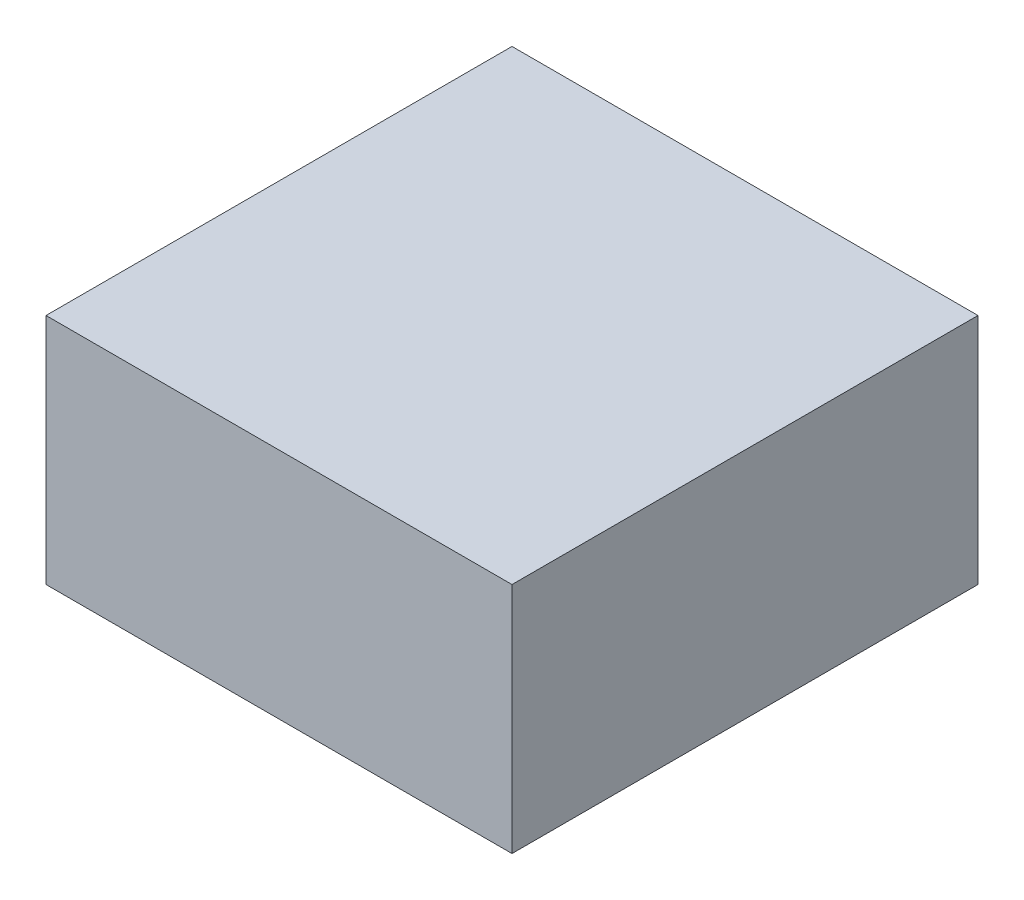
ISO-10303-21;
HEADER;
FILE_DESCRIPTION(('STEP AP214'),'2;1');
FILE_NAME('part.step','',(''),(''),'','','');
FILE_SCHEMA(('AUTOMOTIVE_DESIGN { 1 0 10303 214 1 1 1 1 }'));
ENDSEC;
DATA;
#1=APPLICATION_CONTEXT('core data for automotive mechanical design processes');
#2=APPLICATION_PROTOCOL_DEFINITION('international standard','automotive_design',2000,#1);
#3=PRODUCT_CONTEXT('',#1,'mechanical');
#4=PRODUCT('Part','Part','',(#3));
#5=PRODUCT_RELATED_PRODUCT_CATEGORY('part','',(#4));
#6=PRODUCT_DEFINITION_FORMATION('','',#4);
#7=PRODUCT_DEFINITION_CONTEXT('part definition',#1,'design');
#8=PRODUCT_DEFINITION('design','',#6,#7);
#9=PRODUCT_DEFINITION_SHAPE('','',#8);
#10=(LENGTH_UNIT() NAMED_UNIT(*) SI_UNIT(.MILLI.,.METRE.));
#11=(NAMED_UNIT(*) PLANE_ANGLE_UNIT() SI_UNIT($,.RADIAN.));
#12=(NAMED_UNIT(*) SI_UNIT($,.STERADIAN.) SOLID_ANGLE_UNIT());
#13=UNCERTAINTY_MEASURE_WITH_UNIT(LENGTH_MEASURE(1.E-05),#10,'distance_accuracy_value','');
#14=(GEOMETRIC_REPRESENTATION_CONTEXT(3) GLOBAL_UNCERTAINTY_ASSIGNED_CONTEXT((#13)) GLOBAL_UNIT_ASSIGNED_CONTEXT((#10,
#11,#12)) REPRESENTATION_CONTEXT('',''));
#15=CARTESIAN_POINT('',(0.,0.,0.));
#16=DIRECTION('',(0.,0.,1.));
#17=DIRECTION('',(1.,0.,0.));
#18=AXIS2_PLACEMENT_3D('',#15,#16,#17);
#19=CARTESIAN_POINT('',(15.,15.,15.));
#20=DIRECTION('',(-1.,0.,0.));
#21=DIRECTION('',(0.,0.,1.));
#22=AXIS2_PLACEMENT_3D('',#19,#20,#21);
#23=PLANE('',#22);
#24=DIRECTION('',(0.,0.,-1.));
#25=VECTOR('',#24,1.);
#26=CARTESIAN_POINT('',(15.,0.,15.));
#27=LINE('',#26,#25);
#28=CARTESIAN_POINT('',(15.,0.,15.));
#29=VERTEX_POINT('',#28);
#30=CARTESIAN_POINT('',(15.,0.,-15.));
#31=VERTEX_POINT('',#30);
#32=EDGE_CURVE('E102',#29,#31,#27,.T.);
#33=ORIENTED_EDGE('',*,*,#32,.T.);
#34=DIRECTION('',(0.,-1.,0.));
#35=VECTOR('',#34,1.);
#36=CARTESIAN_POINT('',(15.,15.,-15.));
#37=LINE('',#36,#35);
#38=CARTESIAN_POINT('',(15.,15.,-15.));
#39=VERTEX_POINT('',#38);
#40=EDGE_CURVE('E11',#39,#31,#37,.T.);
#41=ORIENTED_EDGE('',*,*,#40,.F.);
#42=DIRECTION('',(0.,0.,-1.));
#43=VECTOR('',#42,1.);
#44=CARTESIAN_POINT('',(15.,15.,15.));
#45=LINE('',#44,#43);
#46=CARTESIAN_POINT('',(15.,15.,15.));
#47=VERTEX_POINT('',#46);
#48=EDGE_CURVE('E90',#47,#39,#45,.T.);
#49=ORIENTED_EDGE('',*,*,#48,.F.);
#50=DIRECTION('',(0.,-1.,0.));
#51=VECTOR('',#50,1.);
#52=CARTESIAN_POINT('',(15.,15.,15.));
#53=LINE('',#52,#51);
#54=EDGE_CURVE('E98',#47,#29,#53,.T.);
#55=ORIENTED_EDGE('',*,*,#54,.T.);
#56=EDGE_LOOP('',(#33,#41,#49,#55));
#57=FACE_BOUND('',#56,.T.);
#58=ADVANCED_FACE('F39',(#57),#23,.F.);
#59=CARTESIAN_POINT('',(-15.,15.,-15.));
#60=DIRECTION('',(0.,0.,1.));
#61=DIRECTION('',(1.,0.,0.));
#62=AXIS2_PLACEMENT_3D('',#59,#60,#61);
#63=PLANE('',#62);
#64=DIRECTION('',(-1.,0.,0.));
#65=VECTOR('',#64,1.);
#66=CARTESIAN_POINT('',(-15.,0.,-15.));
#67=LINE('',#66,#65);
#68=CARTESIAN_POINT('',(-15.,0.,-15.));
#69=VERTEX_POINT('',#68);
#70=EDGE_CURVE('E94',#31,#69,#67,.T.);
#71=ORIENTED_EDGE('',*,*,#70,.T.);
#72=DIRECTION('',(0.,-1.,0.));
#73=VECTOR('',#72,1.);
#74=CARTESIAN_POINT('',(-15.,15.,-15.));
#75=LINE('',#74,#73);
#76=CARTESIAN_POINT('',(-15.,15.,-15.));
#77=VERTEX_POINT('',#76);
#78=EDGE_CURVE('E47',#77,#69,#75,.T.);
#79=ORIENTED_EDGE('',*,*,#78,.F.);
#80=DIRECTION('',(-1.,0.,0.));
#81=VECTOR('',#80,1.);
#82=CARTESIAN_POINT('',(-15.,15.,-15.));
#83=LINE('',#82,#81);
#84=EDGE_CURVE('E85',#39,#77,#83,.T.);
#85=ORIENTED_EDGE('',*,*,#84,.F.);
#86=ORIENTED_EDGE('',*,*,#40,.T.);
#87=EDGE_LOOP('',(#71,#79,#85,#86));
#88=FACE_BOUND('',#87,.T.);
#89=ADVANCED_FACE('F93',(#88),#63,.F.);
#90=CARTESIAN_POINT('',(-15.,15.,15.));
#91=DIRECTION('',(1.,0.,0.));
#92=DIRECTION('',(0.,0.,-1.));
#93=AXIS2_PLACEMENT_3D('',#90,#91,#92);
#94=PLANE('',#93);
#95=DIRECTION('',(0.,0.,1.));
#96=VECTOR('',#95,1.);
#97=CARTESIAN_POINT('',(-15.,0.,15.));
#98=LINE('',#97,#96);
#99=CARTESIAN_POINT('',(-15.,0.,15.));
#100=VERTEX_POINT('',#99);
#101=EDGE_CURVE('E72',#69,#100,#98,.T.);
#102=ORIENTED_EDGE('',*,*,#101,.T.);
#103=DIRECTION('',(0.,-1.,0.));
#104=VECTOR('',#103,1.);
#105=CARTESIAN_POINT('',(-15.,15.,15.));
#106=LINE('',#105,#104);
#107=CARTESIAN_POINT('',(-15.,15.,15.));
#108=VERTEX_POINT('',#107);
#109=EDGE_CURVE('E95',#108,#100,#106,.T.);
#110=ORIENTED_EDGE('',*,*,#109,.F.);
#111=DIRECTION('',(0.,0.,1.));
#112=VECTOR('',#111,1.);
#113=CARTESIAN_POINT('',(-15.,15.,15.));
#114=LINE('',#113,#112);
#115=EDGE_CURVE('E88',#77,#108,#114,.T.);
#116=ORIENTED_EDGE('',*,*,#115,.F.);
#117=ORIENTED_EDGE('',*,*,#78,.T.);
#118=EDGE_LOOP('',(#102,#110,#116,#117));
#119=FACE_BOUND('',#118,.T.);
#120=ADVANCED_FACE('F96',(#119),#94,.F.);
#121=CARTESIAN_POINT('',(-15.,15.,15.));
#122=DIRECTION('',(0.,0.,-1.));
#123=DIRECTION('',(-1.,0.,0.));
#124=AXIS2_PLACEMENT_3D('',#121,#122,#123);
#125=PLANE('',#124);
#126=DIRECTION('',(1.,0.,0.));
#127=VECTOR('',#126,1.);
#128=CARTESIAN_POINT('',(-15.,0.,15.));
#129=LINE('',#128,#127);
#130=EDGE_CURVE('E78',#100,#29,#129,.T.);
#131=ORIENTED_EDGE('',*,*,#130,.T.);
#132=ORIENTED_EDGE('',*,*,#54,.F.);
#133=DIRECTION('',(1.,0.,0.));
#134=VECTOR('',#133,1.);
#135=CARTESIAN_POINT('',(-15.,15.,15.));
#136=LINE('',#135,#134);
#137=EDGE_CURVE('E55',#108,#47,#136,.T.);
#138=ORIENTED_EDGE('',*,*,#137,.F.);
#139=ORIENTED_EDGE('',*,*,#109,.T.);
#140=EDGE_LOOP('',(#131,#132,#138,#139));
#141=FACE_BOUND('',#140,.T.);
#142=ADVANCED_FACE('F109',(#141),#125,.F.);
#143=CARTESIAN_POINT('',(0.,15.,0.));
#144=DIRECTION('',(0.,-1.,0.));
#145=DIRECTION('',(0.,0.,-1.));
#146=AXIS2_PLACEMENT_3D('',#143,#144,#145);
#147=PLANE('',#146);
#148=ORIENTED_EDGE('',*,*,#48,.T.);
#149=ORIENTED_EDGE('',*,*,#84,.T.);
#150=ORIENTED_EDGE('',*,*,#115,.T.);
#151=ORIENTED_EDGE('',*,*,#137,.T.);
#152=EDGE_LOOP('',(#148,#149,#150,#151));
#153=FACE_BOUND('',#152,.T.);
#154=ADVANCED_FACE('F86',(#153),#147,.F.);
#155=CARTESIAN_POINT('',(0.,0.,0.));
#156=DIRECTION('',(0.,-1.,0.));
#157=DIRECTION('',(0.,0.,-1.));
#158=AXIS2_PLACEMENT_3D('',#155,#156,#157);
#159=PLANE('',#158);
#160=ORIENTED_EDGE('',*,*,#32,.F.);
#161=ORIENTED_EDGE('',*,*,#130,.F.);
#162=ORIENTED_EDGE('',*,*,#101,.F.);
#163=ORIENTED_EDGE('',*,*,#70,.F.);
#164=EDGE_LOOP('',(#160,#161,#162,#163));
#165=FACE_BOUND('',#164,.T.);
#166=ADVANCED_FACE('F112',(#165),#159,.T.);
#167=CLOSED_SHELL('',(#58,#89,#120,#142,#154,#166));
#168=MANIFOLD_SOLID_BREP('B2',#167);
#169=ADVANCED_BREP_SHAPE_REPRESENTATION('',(#18,#168),#14);
#170=SHAPE_DEFINITION_REPRESENTATION(#9,#169);
ENDSEC;
END-ISO-10303-21;
